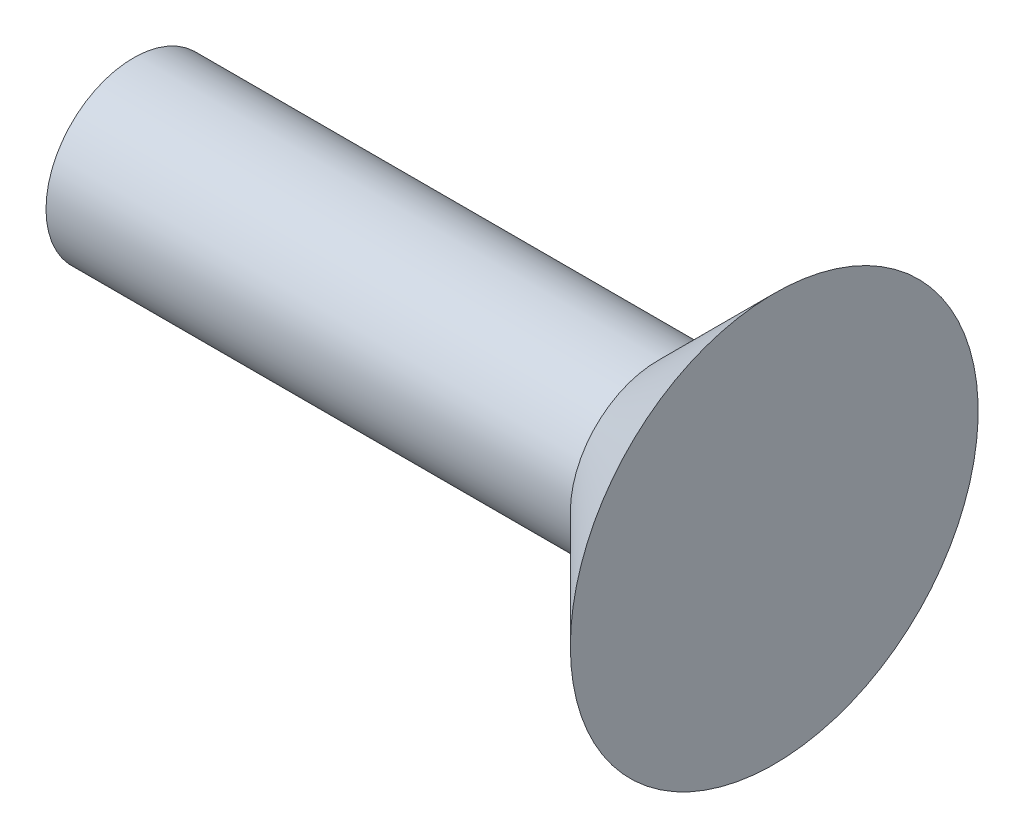
ISO-10303-21;
HEADER;
FILE_DESCRIPTION(('STEP AP214'),'2;1');
FILE_NAME('part.step','',(''),(''),'','','');
FILE_SCHEMA(('AUTOMOTIVE_DESIGN { 1 0 10303 214 1 1 1 1 }'));
ENDSEC;
DATA;
#1=APPLICATION_CONTEXT('core data for automotive mechanical design processes');
#2=APPLICATION_PROTOCOL_DEFINITION('international standard','automotive_design',2000,#1);
#3=PRODUCT_CONTEXT('',#1,'mechanical');
#4=PRODUCT('Part','Part','',(#3));
#5=PRODUCT_RELATED_PRODUCT_CATEGORY('part','',(#4));
#6=PRODUCT_DEFINITION_FORMATION('','',#4);
#7=PRODUCT_DEFINITION_CONTEXT('part definition',#1,'design');
#8=PRODUCT_DEFINITION('design','',#6,#7);
#9=PRODUCT_DEFINITION_SHAPE('','',#8);
#10=(LENGTH_UNIT() NAMED_UNIT(*) SI_UNIT(.MILLI.,.METRE.));
#11=(NAMED_UNIT(*) PLANE_ANGLE_UNIT() SI_UNIT($,.RADIAN.));
#12=(NAMED_UNIT(*) SI_UNIT($,.STERADIAN.) SOLID_ANGLE_UNIT());
#13=UNCERTAINTY_MEASURE_WITH_UNIT(LENGTH_MEASURE(1.E-05),#10,'distance_accuracy_value','');
#14=(GEOMETRIC_REPRESENTATION_CONTEXT(3) GLOBAL_UNCERTAINTY_ASSIGNED_CONTEXT((#13)) GLOBAL_UNIT_ASSIGNED_CONTEXT((#10,
#11,#12)) REPRESENTATION_CONTEXT('',''));
#15=CARTESIAN_POINT('',(0.,0.,0.));
#16=DIRECTION('',(0.,0.,1.));
#17=DIRECTION('',(1.,0.,0.));
#18=AXIS2_PLACEMENT_3D('',#15,#16,#17);
#19=CARTESIAN_POINT('',(-84.0032333856533,17.734385214472,0.));
#20=DIRECTION('',(-1.,0.,0.));
#21=DIRECTION('',(0.,0.,1.));
#22=AXIS2_PLACEMENT_3D('',#19,#20,#21);
#23=CYLINDRICAL_SURFACE('',#22,1.5);
#24=CARTESIAN_POINT('',(-72.0032333856533,17.734385214472,0.));
#25=DIRECTION('',(-1.,0.,0.));
#26=DIRECTION('',(0.,0.,1.));
#27=AXIS2_PLACEMENT_3D('',#24,#25,#26);
#28=CIRCLE('',#27,1.5);
#29=CARTESIAN_POINT('',(-72.0032333856533,17.734385214472,1.5));
#30=VERTEX_POINT('',#29);
#31=EDGE_CURVE('E10',#30,#30,#28,.T.);
#32=ORIENTED_EDGE('',*,*,#31,.T.);
#33=EDGE_LOOP('',(#32));
#34=FACE_BOUND('',#33,.T.);
#35=CARTESIAN_POINT('',(-81.0032333856533,17.734385214472,0.));
#36=DIRECTION('',(-1.,0.,0.));
#37=DIRECTION('',(0.,0.,1.));
#38=AXIS2_PLACEMENT_3D('',#35,#36,#37);
#39=CIRCLE('',#38,1.5);
#40=CARTESIAN_POINT('',(-81.0032333856533,17.734385214472,1.5));
#41=VERTEX_POINT('',#40);
#42=EDGE_CURVE('E38',#41,#41,#39,.T.);
#43=ORIENTED_EDGE('',*,*,#42,.F.);
#44=EDGE_LOOP('',(#43));
#45=FACE_BOUND('',#44,.T.);
#46=ADVANCED_FACE('F35',(#34,#45),#23,.T.);
#47=CARTESIAN_POINT('',(-70.0032333856533,17.734385214472,0.));
#48=DIRECTION('',(1.,0.,0.));
#49=DIRECTION('',(0.,0.,-1.));
#50=AXIS2_PLACEMENT_3D('',#47,#48,#49);
#51=CONICAL_SURFACE('',#50,3.5,0.785398163397447);
#52=ORIENTED_EDGE('',*,*,#31,.F.);
#53=EDGE_LOOP('',(#52));
#54=FACE_BOUND('',#53,.T.);
#55=CARTESIAN_POINT('',(-70.0032333856533,17.734385214472,0.));
#56=DIRECTION('',(-1.,0.,0.));
#57=DIRECTION('',(0.,0.,1.));
#58=AXIS2_PLACEMENT_3D('',#55,#56,#57);
#59=CIRCLE('',#58,3.5);
#60=CARTESIAN_POINT('',(-70.0032333856533,17.734385214472,3.5));
#61=VERTEX_POINT('',#60);
#62=EDGE_CURVE('E42',#61,#61,#59,.T.);
#63=ORIENTED_EDGE('',*,*,#62,.T.);
#64=EDGE_LOOP('',(#63));
#65=FACE_BOUND('',#64,.T.);
#66=ADVANCED_FACE('F55',(#54,#65),#51,.T.);
#67=CARTESIAN_POINT('',(-70.0032333856533,17.734385214472,0.));
#68=DIRECTION('',(-1.,0.,0.));
#69=DIRECTION('',(0.,0.,1.));
#70=AXIS2_PLACEMENT_3D('',#67,#68,#69);
#71=PLANE('',#70);
#72=ORIENTED_EDGE('',*,*,#62,.F.);
#73=EDGE_LOOP('',(#72));
#74=FACE_BOUND('',#73,.T.);
#75=ADVANCED_FACE('F61',(#74),#71,.F.);
#76=CARTESIAN_POINT('',(-81.0032333856533,0.,0.));
#77=DIRECTION('',(-1.,0.,0.));
#78=DIRECTION('',(0.,0.,1.));
#79=AXIS2_PLACEMENT_3D('',#76,#77,#78);
#80=PLANE('',#79);
#81=ORIENTED_EDGE('',*,*,#42,.T.);
#82=EDGE_LOOP('',(#81));
#83=FACE_BOUND('',#82,.T.);
#84=ADVANCED_FACE('F52',(#83),#80,.T.);
#85=CLOSED_SHELL('',(#46,#66,#75,#84));
#86=MANIFOLD_SOLID_BREP('B2',#85);
#87=ADVANCED_BREP_SHAPE_REPRESENTATION('',(#18,#86),#14);
#88=SHAPE_DEFINITION_REPRESENTATION(#9,#87);
ENDSEC;
END-ISO-10303-21;
